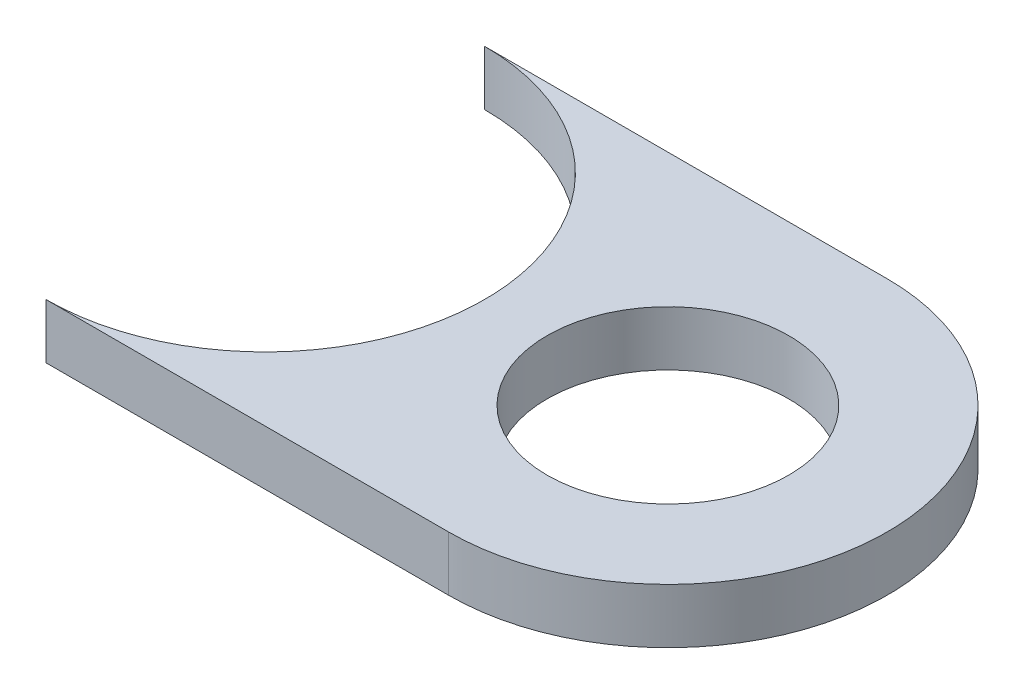
ISO-10303-21;
HEADER;
FILE_DESCRIPTION(('STEP AP214'),'2;1');
FILE_NAME('part.step','',(''),(''),'','','');
FILE_SCHEMA(('AUTOMOTIVE_DESIGN { 1 0 10303 214 1 1 1 1 }'));
ENDSEC;
DATA;
#1=APPLICATION_CONTEXT('core data for automotive mechanical design processes');
#2=APPLICATION_PROTOCOL_DEFINITION('international standard','automotive_design',2000,#1);
#3=PRODUCT_CONTEXT('',#1,'mechanical');
#4=PRODUCT('Part','Part','',(#3));
#5=PRODUCT_RELATED_PRODUCT_CATEGORY('part','',(#4));
#6=PRODUCT_DEFINITION_FORMATION('','',#4);
#7=PRODUCT_DEFINITION_CONTEXT('part definition',#1,'design');
#8=PRODUCT_DEFINITION('design','',#6,#7);
#9=PRODUCT_DEFINITION_SHAPE('','',#8);
#10=(LENGTH_UNIT() NAMED_UNIT(*) SI_UNIT(.MILLI.,.METRE.));
#11=(NAMED_UNIT(*) PLANE_ANGLE_UNIT() SI_UNIT($,.RADIAN.));
#12=(NAMED_UNIT(*) SI_UNIT($,.STERADIAN.) SOLID_ANGLE_UNIT());
#13=UNCERTAINTY_MEASURE_WITH_UNIT(LENGTH_MEASURE(1.E-05),#10,'distance_accuracy_value','');
#14=(GEOMETRIC_REPRESENTATION_CONTEXT(3) GLOBAL_UNCERTAINTY_ASSIGNED_CONTEXT((#13)) GLOBAL_UNIT_ASSIGNED_CONTEXT((#10,
#11,#12)) REPRESENTATION_CONTEXT('',''));
#15=CARTESIAN_POINT('',(0.,0.,0.));
#16=DIRECTION('',(0.,0.,1.));
#17=DIRECTION('',(1.,0.,0.));
#18=AXIS2_PLACEMENT_3D('',#15,#16,#17);
#19=CARTESIAN_POINT('',(-23.3172,3.175,0.));
#20=DIRECTION('',(0.,1.,0.));
#21=DIRECTION('',(0.,0.,1.));
#22=AXIS2_PLACEMENT_3D('',#19,#20,#21);
#23=PLANE('',#22);
#24=CARTESIAN_POINT('',(-23.3172,3.175,0.));
#25=DIRECTION('',(0.,-1.,0.));
#26=DIRECTION('',(0.,0.,1.));
#27=AXIS2_PLACEMENT_3D('',#24,#25,#26);
#28=CIRCLE('',#27,12.7);
#29=CARTESIAN_POINT('',(-23.3172,3.175,-12.7));
#30=VERTEX_POINT('',#29);
#31=CARTESIAN_POINT('',(-23.3172,3.175,12.7));
#32=VERTEX_POINT('',#31);
#33=EDGE_CURVE('E94',#30,#32,#28,.T.);
#34=ORIENTED_EDGE('',*,*,#33,.T.);
#35=DIRECTION('',(1.,0.,0.));
#36=VECTOR('',#35,1.);
#37=CARTESIAN_POINT('',(-23.3172,3.175,12.7));
#38=LINE('',#37,#36);
#39=CARTESIAN_POINT('',(0.,3.175,12.7));
#40=VERTEX_POINT('',#39);
#41=EDGE_CURVE('E89',#32,#40,#38,.T.);
#42=ORIENTED_EDGE('',*,*,#41,.T.);
#43=CARTESIAN_POINT('',(0.,3.175,0.));
#44=DIRECTION('',(0.,1.,0.));
#45=DIRECTION('',(0.,0.,1.));
#46=AXIS2_PLACEMENT_3D('',#43,#44,#45);
#47=CIRCLE('',#46,12.7);
#48=CARTESIAN_POINT('',(0.,3.175,-12.7));
#49=VERTEX_POINT('',#48);
#50=EDGE_CURVE('E92',#40,#49,#47,.T.);
#51=ORIENTED_EDGE('',*,*,#50,.T.);
#52=DIRECTION('',(-1.,0.,0.));
#53=VECTOR('',#52,1.);
#54=CARTESIAN_POINT('',(-23.3172,3.175,-12.7));
#55=LINE('',#54,#53);
#56=EDGE_CURVE('E59',#49,#30,#55,.T.);
#57=ORIENTED_EDGE('',*,*,#56,.T.);
#58=EDGE_LOOP('',(#34,#42,#51,#57));
#59=FACE_BOUND('',#58,.T.);
#60=CARTESIAN_POINT('',(0.,3.175,0.));
#61=DIRECTION('',(0.,1.,0.));
#62=DIRECTION('',(0.,0.,1.));
#63=AXIS2_PLACEMENT_3D('',#60,#61,#62);
#64=CIRCLE('',#63,7.00024);
#65=CARTESIAN_POINT('',(0.,3.175,7.00024));
#66=VERTEX_POINT('',#65);
#67=EDGE_CURVE('E109',#66,#66,#64,.T.);
#68=ORIENTED_EDGE('',*,*,#67,.F.);
#69=EDGE_LOOP('',(#68));
#70=FACE_BOUND('',#69,.T.);
#71=ADVANCED_FACE('F42',(#59,#70),#23,.T.);
#72=CARTESIAN_POINT('',(-23.3172,0.,0.));
#73=DIRECTION('',(0.,1.,0.));
#74=DIRECTION('',(0.,0.,1.));
#75=AXIS2_PLACEMENT_3D('',#72,#73,#74);
#76=PLANE('',#75);
#77=CARTESIAN_POINT('',(-23.3172,0.,0.));
#78=DIRECTION('',(0.,-1.,0.));
#79=DIRECTION('',(0.,0.,1.));
#80=AXIS2_PLACEMENT_3D('',#77,#78,#79);
#81=CIRCLE('',#80,12.7);
#82=CARTESIAN_POINT('',(-23.3172,0.,-12.7));
#83=VERTEX_POINT('',#82);
#84=CARTESIAN_POINT('',(-23.3172,0.,12.7));
#85=VERTEX_POINT('',#84);
#86=EDGE_CURVE('E106',#83,#85,#81,.T.);
#87=ORIENTED_EDGE('',*,*,#86,.F.);
#88=DIRECTION('',(-1.,0.,0.));
#89=VECTOR('',#88,1.);
#90=CARTESIAN_POINT('',(-23.3172,0.,-12.7));
#91=LINE('',#90,#89);
#92=CARTESIAN_POINT('',(0.,0.,-12.7));
#93=VERTEX_POINT('',#92);
#94=EDGE_CURVE('E82',#93,#83,#91,.T.);
#95=ORIENTED_EDGE('',*,*,#94,.F.);
#96=CARTESIAN_POINT('',(0.,0.,0.));
#97=DIRECTION('',(0.,1.,0.));
#98=DIRECTION('',(0.,0.,1.));
#99=AXIS2_PLACEMENT_3D('',#96,#97,#98);
#100=CIRCLE('',#99,12.7);
#101=CARTESIAN_POINT('',(0.,0.,12.7));
#102=VERTEX_POINT('',#101);
#103=EDGE_CURVE('E76',#102,#93,#100,.T.);
#104=ORIENTED_EDGE('',*,*,#103,.F.);
#105=DIRECTION('',(1.,0.,0.));
#106=VECTOR('',#105,1.);
#107=CARTESIAN_POINT('',(-23.3172,0.,12.7));
#108=LINE('',#107,#106);
#109=EDGE_CURVE('E98',#85,#102,#108,.T.);
#110=ORIENTED_EDGE('',*,*,#109,.F.);
#111=EDGE_LOOP('',(#87,#95,#104,#110));
#112=FACE_BOUND('',#111,.T.);
#113=CARTESIAN_POINT('',(0.,0.,0.));
#114=DIRECTION('',(0.,1.,0.));
#115=DIRECTION('',(0.,0.,1.));
#116=AXIS2_PLACEMENT_3D('',#113,#114,#115);
#117=CIRCLE('',#116,7.00024);
#118=CARTESIAN_POINT('',(0.,0.,7.00024));
#119=VERTEX_POINT('',#118);
#120=EDGE_CURVE('E121',#119,#119,#117,.T.);
#121=ORIENTED_EDGE('',*,*,#120,.T.);
#122=EDGE_LOOP('',(#121));
#123=FACE_BOUND('',#122,.T.);
#124=ADVANCED_FACE('F117',(#112,#123),#76,.F.);
#125=CARTESIAN_POINT('',(-23.3172,3.175,0.));
#126=DIRECTION('',(0.,-1.,0.));
#127=DIRECTION('',(0.,0.,-1.));
#128=AXIS2_PLACEMENT_3D('',#125,#126,#127);
#129=CYLINDRICAL_SURFACE('',#128,12.7);
#130=ORIENTED_EDGE('',*,*,#86,.T.);
#131=DIRECTION('',(0.,-1.,0.));
#132=VECTOR('',#131,1.);
#133=CARTESIAN_POINT('',(-23.3172,3.175,12.7));
#134=LINE('',#133,#132);
#135=EDGE_CURVE('E11',#32,#85,#134,.T.);
#136=ORIENTED_EDGE('',*,*,#135,.F.);
#137=ORIENTED_EDGE('',*,*,#33,.F.);
#138=DIRECTION('',(0.,-1.,0.));
#139=VECTOR('',#138,1.);
#140=CARTESIAN_POINT('',(-23.3172,3.175,-12.7));
#141=LINE('',#140,#139);
#142=EDGE_CURVE('E102',#30,#83,#141,.T.);
#143=ORIENTED_EDGE('',*,*,#142,.T.);
#144=EDGE_LOOP('',(#130,#136,#137,#143));
#145=FACE_BOUND('',#144,.T.);
#146=ADVANCED_FACE('F44',(#145),#129,.F.);
#147=CARTESIAN_POINT('',(-23.3172,3.175,12.7));
#148=DIRECTION('',(0.,0.,-1.));
#149=DIRECTION('',(-1.,0.,0.));
#150=AXIS2_PLACEMENT_3D('',#147,#148,#149);
#151=PLANE('',#150);
#152=ORIENTED_EDGE('',*,*,#109,.T.);
#153=DIRECTION('',(0.,-1.,0.));
#154=VECTOR('',#153,1.);
#155=CARTESIAN_POINT('',(0.,3.175,12.7));
#156=LINE('',#155,#154);
#157=EDGE_CURVE('E51',#40,#102,#156,.T.);
#158=ORIENTED_EDGE('',*,*,#157,.F.);
#159=ORIENTED_EDGE('',*,*,#41,.F.);
#160=ORIENTED_EDGE('',*,*,#135,.T.);
#161=EDGE_LOOP('',(#152,#158,#159,#160));
#162=FACE_BOUND('',#161,.T.);
#163=ADVANCED_FACE('F97',(#162),#151,.F.);
#164=CARTESIAN_POINT('',(0.,3.175,0.));
#165=DIRECTION('',(0.,-1.,0.));
#166=DIRECTION('',(0.,0.,-1.));
#167=AXIS2_PLACEMENT_3D('',#164,#165,#166);
#168=CYLINDRICAL_SURFACE('',#167,12.7);
#169=ORIENTED_EDGE('',*,*,#103,.T.);
#170=DIRECTION('',(0.,-1.,0.));
#171=VECTOR('',#170,1.);
#172=CARTESIAN_POINT('',(0.,3.175,-12.7));
#173=LINE('',#172,#171);
#174=EDGE_CURVE('E99',#49,#93,#173,.T.);
#175=ORIENTED_EDGE('',*,*,#174,.F.);
#176=ORIENTED_EDGE('',*,*,#50,.F.);
#177=ORIENTED_EDGE('',*,*,#157,.T.);
#178=EDGE_LOOP('',(#169,#175,#176,#177));
#179=FACE_BOUND('',#178,.T.);
#180=ADVANCED_FACE('F100',(#179),#168,.T.);
#181=CARTESIAN_POINT('',(-23.3172,3.175,-12.7));
#182=DIRECTION('',(0.,0.,1.));
#183=DIRECTION('',(1.,0.,0.));
#184=AXIS2_PLACEMENT_3D('',#181,#182,#183);
#185=PLANE('',#184);
#186=ORIENTED_EDGE('',*,*,#94,.T.);
#187=ORIENTED_EDGE('',*,*,#142,.F.);
#188=ORIENTED_EDGE('',*,*,#56,.F.);
#189=ORIENTED_EDGE('',*,*,#174,.T.);
#190=EDGE_LOOP('',(#186,#187,#188,#189));
#191=FACE_BOUND('',#190,.T.);
#192=ADVANCED_FACE('F114',(#191),#185,.F.);
#193=CARTESIAN_POINT('',(0.,3.175,0.));
#194=DIRECTION('',(0.,-1.,0.));
#195=DIRECTION('',(0.,0.,-1.));
#196=AXIS2_PLACEMENT_3D('',#193,#194,#195);
#197=CYLINDRICAL_SURFACE('',#196,7.00024);
#198=ORIENTED_EDGE('',*,*,#67,.T.);
#199=EDGE_LOOP('',(#198));
#200=FACE_BOUND('',#199,.T.);
#201=ORIENTED_EDGE('',*,*,#120,.F.);
#202=EDGE_LOOP('',(#201));
#203=FACE_BOUND('',#202,.T.);
#204=ADVANCED_FACE('F127',(#200,#203),#197,.F.);
#205=CLOSED_SHELL('',(#71,#124,#146,#163,#180,#192,#204));
#206=MANIFOLD_SOLID_BREP('B2',#205);
#207=ADVANCED_BREP_SHAPE_REPRESENTATION('',(#18,#206),#14);
#208=SHAPE_DEFINITION_REPRESENTATION(#9,#207);
ENDSEC;
END-ISO-10303-21;
